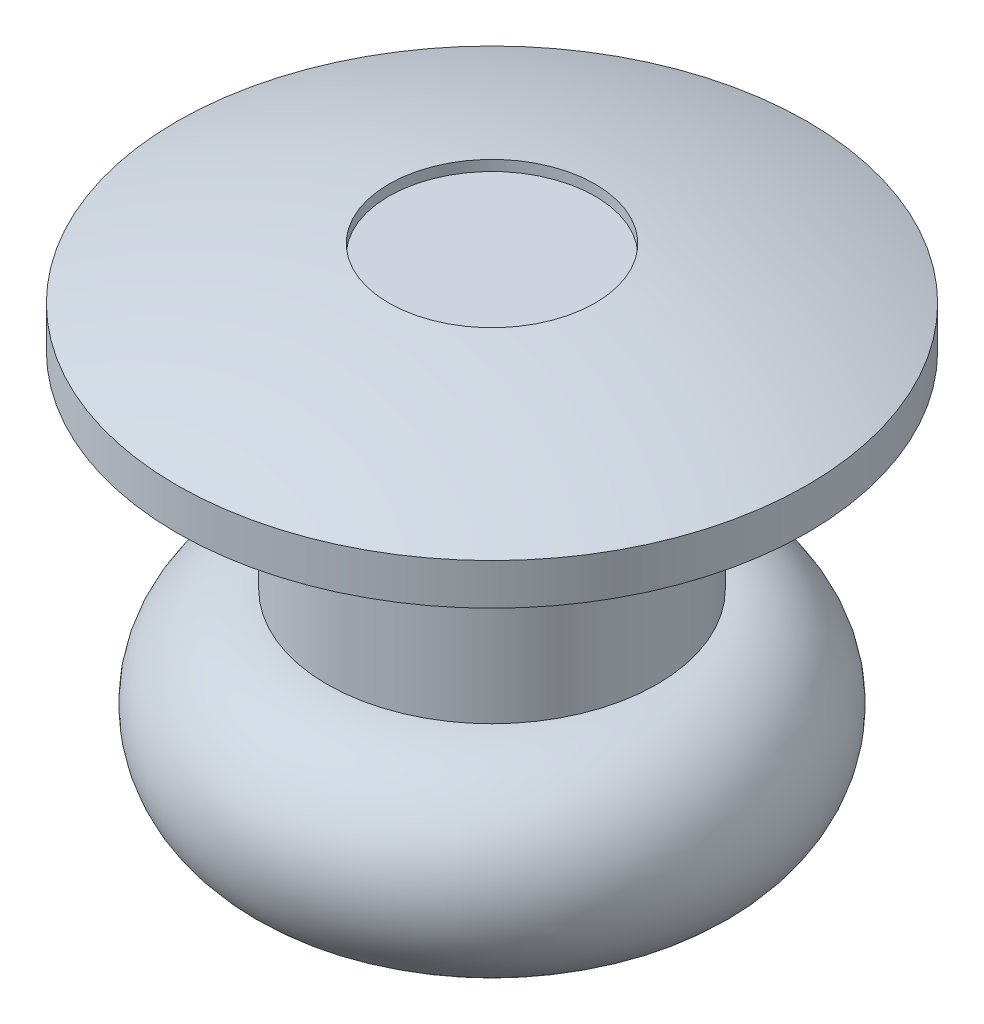
ISO-10303-21;
HEADER;
FILE_DESCRIPTION(('STEP AP214'),'2;1');
FILE_NAME('part.step','',(''),(''),'','','');
FILE_SCHEMA(('AUTOMOTIVE_DESIGN { 1 0 10303 214 1 1 1 1 }'));
ENDSEC;
DATA;
#1=APPLICATION_CONTEXT('core data for automotive mechanical design processes');
#2=APPLICATION_PROTOCOL_DEFINITION('international standard','automotive_design',2000,#1);
#3=PRODUCT_CONTEXT('',#1,'mechanical');
#4=PRODUCT('Part','Part','',(#3));
#5=PRODUCT_RELATED_PRODUCT_CATEGORY('part','',(#4));
#6=PRODUCT_DEFINITION_FORMATION('','',#4);
#7=PRODUCT_DEFINITION_CONTEXT('part definition',#1,'design');
#8=PRODUCT_DEFINITION('design','',#6,#7);
#9=PRODUCT_DEFINITION_SHAPE('','',#8);
#10=(LENGTH_UNIT() NAMED_UNIT(*) SI_UNIT(.MILLI.,.METRE.));
#11=(NAMED_UNIT(*) PLANE_ANGLE_UNIT() SI_UNIT($,.RADIAN.));
#12=(NAMED_UNIT(*) SI_UNIT($,.STERADIAN.) SOLID_ANGLE_UNIT());
#13=UNCERTAINTY_MEASURE_WITH_UNIT(LENGTH_MEASURE(1.E-05),#10,'distance_accuracy_value','');
#14=(GEOMETRIC_REPRESENTATION_CONTEXT(3) GLOBAL_UNCERTAINTY_ASSIGNED_CONTEXT((#13)) GLOBAL_UNIT_ASSIGNED_CONTEXT((#10,
#11,#12)) REPRESENTATION_CONTEXT('',''));
#15=CARTESIAN_POINT('',(0.,0.,0.));
#16=DIRECTION('',(0.,0.,1.));
#17=DIRECTION('',(1.,0.,0.));
#18=AXIS2_PLACEMENT_3D('',#15,#16,#17);
#19=CARTESIAN_POINT('',(0.,-0.2,0.));
#20=DIRECTION('',(0.,1.,0.));
#21=DIRECTION('',(-1.,0.,0.));
#22=AXIS2_PLACEMENT_3D('',#19,#20,#21);
#23=CYLINDRICAL_SURFACE('',#22,3.82);
#24=CARTESIAN_POINT('',(0.,-0.7,0.));
#25=DIRECTION('',(0.,1.,0.));
#26=DIRECTION('',(-1.,0.,0.));
#27=AXIS2_PLACEMENT_3D('',#24,#25,#26);
#28=CIRCLE('',#27,3.82);
#29=CARTESIAN_POINT('',(3.82,-0.699999999999999,0.));
#30=VERTEX_POINT('',#29);
#31=EDGE_CURVE('E58',#30,#30,#28,.T.);
#32=ORIENTED_EDGE('',*,*,#31,.F.);
#33=EDGE_LOOP('',(#32));
#34=FACE_BOUND('',#33,.T.);
#35=CARTESIAN_POINT('',(0.,-1.2,0.));
#36=DIRECTION('',(0.,1.,0.));
#37=DIRECTION('',(-1.,0.,0.));
#38=AXIS2_PLACEMENT_3D('',#35,#36,#37);
#39=CIRCLE('',#38,3.82);
#40=CARTESIAN_POINT('',(-3.82,-1.2,0.));
#41=VERTEX_POINT('',#40);
#42=EDGE_CURVE('E10',#41,#41,#39,.T.);
#43=ORIENTED_EDGE('',*,*,#42,.T.);
#44=EDGE_LOOP('',(#43));
#45=FACE_BOUND('',#44,.T.);
#46=ADVANCED_FACE('F33',(#34,#45),#23,.T.);
#47=CARTESIAN_POINT('',(3.82,-1.2,0.));
#48=DIRECTION('',(0.,1.,0.));
#49=DIRECTION('',(-1.,0.,0.));
#50=AXIS2_PLACEMENT_3D('',#47,#48,#49);
#51=PLANE('',#50);
#52=ORIENTED_EDGE('',*,*,#42,.F.);
#53=EDGE_LOOP('',(#52));
#54=FACE_BOUND('',#53,.T.);
#55=CARTESIAN_POINT('',(0.,-1.2,0.));
#56=DIRECTION('',(0.,1.,0.));
#57=DIRECTION('',(-1.,0.,0.));
#58=AXIS2_PLACEMENT_3D('',#55,#56,#57);
#59=CIRCLE('',#58,2.);
#60=CARTESIAN_POINT('',(-2.,-1.2,0.));
#61=VERTEX_POINT('',#60);
#62=EDGE_CURVE('E39',#61,#61,#59,.T.);
#63=ORIENTED_EDGE('',*,*,#62,.T.);
#64=EDGE_LOOP('',(#63));
#65=FACE_BOUND('',#64,.T.);
#66=ADVANCED_FACE('F65',(#54,#65),#51,.F.);
#67=CARTESIAN_POINT('',(0.,-0.2,0.));
#68=DIRECTION('',(0.,1.,0.));
#69=DIRECTION('',(-1.,0.,0.));
#70=AXIS2_PLACEMENT_3D('',#67,#68,#69);
#71=CYLINDRICAL_SURFACE('',#70,2.);
#72=ORIENTED_EDGE('',*,*,#62,.F.);
#73=EDGE_LOOP('',(#72));
#74=FACE_BOUND('',#73,.T.);
#75=CARTESIAN_POINT('',(0.,-3.7,0.));
#76=DIRECTION('',(0.,1.,0.));
#77=DIRECTION('',(-1.,0.,0.));
#78=AXIS2_PLACEMENT_3D('',#75,#76,#77);
#79=CIRCLE('',#78,2.);
#80=CARTESIAN_POINT('',(-2.,-3.7,0.));
#81=VERTEX_POINT('',#80);
#82=EDGE_CURVE('E43',#81,#81,#79,.T.);
#83=ORIENTED_EDGE('',*,*,#82,.T.);
#84=EDGE_LOOP('',(#83));
#85=FACE_BOUND('',#84,.T.);
#86=ADVANCED_FACE('F69',(#74,#85),#71,.T.);
#87=CARTESIAN_POINT('',(0.,-4.9,0.));
#88=DIRECTION('',(0.,1.,0.));
#89=DIRECTION('',(-1.,0.,0.));
#90=AXIS2_PLACEMENT_3D('',#87,#88,#89);
#91=TOROIDAL_SURFACE('',#90,2.,1.2);
#92=ORIENTED_EDGE('',*,*,#82,.F.);
#93=EDGE_LOOP('',(#92));
#94=FACE_BOUND('',#93,.T.);
#95=CARTESIAN_POINT('',(0.,-6.1,0.));
#96=DIRECTION('',(0.,1.,0.));
#97=DIRECTION('',(-1.,0.,0.));
#98=AXIS2_PLACEMENT_3D('',#95,#96,#97);
#99=CIRCLE('',#98,2.);
#100=CARTESIAN_POINT('',(-2.,-6.1,0.));
#101=VERTEX_POINT('',#100);
#102=EDGE_CURVE('E47',#101,#101,#99,.T.);
#103=ORIENTED_EDGE('',*,*,#102,.T.);
#104=EDGE_LOOP('',(#103));
#105=FACE_BOUND('',#104,.T.);
#106=ADVANCED_FACE('F74',(#94,#105),#91,.T.);
#107=CARTESIAN_POINT('',(2.,-6.1,0.));
#108=DIRECTION('',(0.,1.,0.));
#109=DIRECTION('',(-1.,0.,0.));
#110=AXIS2_PLACEMENT_3D('',#107,#108,#109);
#111=PLANE('',#110);
#112=ORIENTED_EDGE('',*,*,#102,.F.);
#113=EDGE_LOOP('',(#112));
#114=FACE_BOUND('',#113,.T.);
#115=ADVANCED_FACE('F80',(#114),#111,.F.);
#116=CARTESIAN_POINT('',(0.,-0.2,0.));
#117=DIRECTION('',(0.,-1.,0.));
#118=DIRECTION('',(1.,0.,0.));
#119=AXIS2_PLACEMENT_3D('',#116,#117,#118);
#120=PLANE('',#119);
#121=CARTESIAN_POINT('',(0.,-0.2,0.));
#122=DIRECTION('',(0.,1.,0.));
#123=DIRECTION('',(-1.,0.,0.));
#124=AXIS2_PLACEMENT_3D('',#121,#122,#123);
#125=CIRCLE('',#124,1.25);
#126=CARTESIAN_POINT('',(-1.25,-0.2,0.));
#127=VERTEX_POINT('',#126);
#128=EDGE_CURVE('E52',#127,#127,#125,.T.);
#129=ORIENTED_EDGE('',*,*,#128,.T.);
#130=EDGE_LOOP('',(#129));
#131=FACE_BOUND('',#130,.T.);
#132=ADVANCED_FACE('F84',(#131),#120,.F.);
#133=CARTESIAN_POINT('',(0.,-0.2,0.));
#134=DIRECTION('',(0.,1.,0.));
#135=DIRECTION('',(-1.,0.,0.));
#136=AXIS2_PLACEMENT_3D('',#133,#134,#135);
#137=CYLINDRICAL_SURFACE('',#136,1.25);
#138=ORIENTED_EDGE('',*,*,#128,.F.);
#139=EDGE_LOOP('',(#138));
#140=FACE_BOUND('',#139,.T.);
#141=CARTESIAN_POINT('',(0.,-0.0727640311195389,0.));
#142=DIRECTION('',(0.,1.,0.));
#143=DIRECTION('',(-1.,0.,0.));
#144=AXIS2_PLACEMENT_3D('',#141,#142,#143);
#145=CIRCLE('',#144,1.25);
#146=CARTESIAN_POINT('',(1.25000000000001,-0.0727640311195404,0.));
#147=VERTEX_POINT('',#146);
#148=EDGE_CURVE('E55',#147,#147,#145,.T.);
#149=ORIENTED_EDGE('',*,*,#148,.T.);
#150=EDGE_LOOP('',(#149));
#151=FACE_BOUND('',#150,.T.);
#152=ADVANCED_FACE('F88',(#140,#151),#137,.F.);
#153=CARTESIAN_POINT('',(0.,-10.7731428571429,0.));
#154=DIRECTION('',(0.,1.,0.));
#155=DIRECTION('',(1.,0.,0.));
#156=AXIS2_PLACEMENT_3D('',#153,#154,#155);
#157=SPHERICAL_SURFACE('',#156,10.7731428571429);
#158=CARTESIAN_POINT('',(1.25000000000001,-0.0727640311195404,0.));
#159=CARTESIAN_POINT('',(1.27743972690055,-0.0759694909310241,0.));
#160=CARTESIAN_POINT('',(1.30486712327214,-0.0792805035479182,0.));
#161=CARTESIAN_POINT('',(1.35969563293125,-0.0861134285906737,0.));
#162=CARTESIAN_POINT('',(1.38709674621877,-0.0896353410165352,0.));
#163=CARTESIAN_POINT('',(1.44187106768358,-0.0968898598753719,0.));
#164=CARTESIAN_POINT('',(1.46924427586086,-0.100622466308347,0.));
#165=CARTESIAN_POINT('',(1.52396116714738,-0.108298151565427,0.));
#166=CARTESIAN_POINT('',(1.55130485025661,-0.112241230389532,0.));
#167=CARTESIAN_POINT('',(1.60596107308491,-0.12033762725252,0.));
#168=CARTESIAN_POINT('',(1.63327361280398,-0.124490945291403,0.));
#169=CARTESIAN_POINT('',(1.68786593240294,-0.133007574724754,0.));
#170=CARTESIAN_POINT('',(1.71514571228283,-0.137370886119222,0.));
#171=CARTESIAN_POINT('',(1.76967089768527,-0.146307244040716,0.));
#172=CARTESIAN_POINT('',(1.79691630320782,-0.150880290567742,0.));
#173=CARTESIAN_POINT('',(1.85137112741394,-0.160235848101206,0.));
#174=CARTESIAN_POINT('',(1.87858054609751,-0.165018359107642,0.));
#175=CARTESIAN_POINT('',(1.9329617862733,-0.174792562554524,0.));
#176=CARTESIAN_POINT('',(1.96013360776552,-0.179784254994969,0.));
#177=CARTESIAN_POINT('',(2.01443804543153,-0.189976525883112,0.));
#178=CARTESIAN_POINT('',(2.04157066160532,-0.195177104330812,0.));
#179=CARTESIAN_POINT('',(2.09579508282766,-0.205786839444407,0.));
#180=CARTESIAN_POINT('',(2.12288688787621,-0.211195996110302,0.));
#181=CARTESIAN_POINT('',(2.17702808345663,-0.222222567526729,0.));
#182=CARTESIAN_POINT('',(2.2040774739885,-0.227839982277259,0.));
#183=CARTESIAN_POINT('',(2.25813223965435,-0.239282737403948,0.));
#184=CARTESIAN_POINT('',(2.28513761478832,-0.245108077780105,0.));
#185=CARTESIAN_POINT('',(2.33910275138218,-0.256966339393238,0.));
#186=CARTESIAN_POINT('',(2.36606251284205,-0.262999260630213,0.));
#187=CARTESIAN_POINT('',(2.41993482651107,-0.275272326914786,0.));
#188=CARTESIAN_POINT('',(2.44684737872022,-0.281512471962383,0.));
#189=CARTESIAN_POINT('',(2.50062368110516,-0.294199616553744,0.));
#190=CARTESIAN_POINT('',(2.52748743128096,-0.300646616097508,0.));
#191=CARTESIAN_POINT('',(2.58116453970487,-0.313747088124347,0.));
#192=CARTESIAN_POINT('',(2.60797789795299,-0.320400560607422,0.));
#193=CARTESIAN_POINT('',(2.66155263560959,-0.33391358473621,0.));
#194=CARTESIAN_POINT('',(2.68831401501807,-0.340773136381924,0.));
#195=CARTESIAN_POINT('',(2.74178321115975,-0.354697912862799,0.));
#196=CARTESIAN_POINT('',(2.76849102789293,-0.36176313769796,0.));
#197=CARTESIAN_POINT('',(2.82185151801839,-0.37609884241206,0.));
#198=CARTESIAN_POINT('',(2.84850419141066,-0.383369322290998,0.));
#199=CARTESIAN_POINT('',(2.90175281745223,-0.398115106799237,0.));
#200=CARTESIAN_POINT('',(2.92834877010154,-0.405590411428539,0.));
#201=CARTESIAN_POINT('',(2.98148238061209,-0.420745403021813,0.));
#202=CARTESIAN_POINT('',(3.00802003847333,-0.428425089985786,0.));
#203=CARTESIAN_POINT('',(3.06103548881274,-0.443988391736646,0.));
#204=CARTESIAN_POINT('',(3.0875132812909,-0.451872006523533,0.));
#205=CARTESIAN_POINT('',(3.14040743381223,-0.467842697339194,0.));
#206=CARTESIAN_POINT('',(3.16682379385539,-0.475929773367967,0.));
#207=CARTESIAN_POINT('',(3.21959351809046,-0.492306908045102,0.));
#208=CARTESIAN_POINT('',(3.24594688228237,-0.500596966693464,0.));
#209=CARTESIAN_POINT('',(3.29858905512743,-0.517379575973066,0.));
#210=CARTESIAN_POINT('',(3.32487786378058,-0.525872126604307,0.));
#211=CARTESIAN_POINT('',(3.37738936967966,-0.543059217233112,0.));
#212=CARTESIAN_POINT('',(3.40361206692559,-0.551753757230675,0.));
#213=CARTESIAN_POINT('',(3.45598979806047,-0.569344312004811,0.));
#214=CARTESIAN_POINT('',(3.48214483194943,-0.578240326781382,0.));
#215=CARTESIAN_POINT('',(3.53438568840269,-0.59623330466301,0.));
#216=CARTESIAN_POINT('',(3.560471510967,-0.605330267768065,0.));
#217=CARTESIAN_POINT('',(3.6125724009835,-0.623724603736377,0.));
#218=CARTESIAN_POINT('',(3.63858746843569,-0.633021976599633,0.));
#219=CARTESIAN_POINT('',(3.69054530831434,-0.651816582499929,0.));
#220=CARTESIAN_POINT('',(3.7164880807408,-0.661313815536968,0.));
#221=CARTESIAN_POINT('',(3.76829979610384,-0.680507577211487,0.));
#222=CARTESIAN_POINT('',(3.79416873904042,-0.690204105848968,0.));
#223=CARTESIAN_POINT('',(3.82,-0.699999999999999,0.));
#224=B_SPLINE_CURVE_WITH_KNOTS('',3,(#158,#159,#160,#161,#162,#163,#164,#165,#166,#167,#168,
#169,#170,#171,#172,#173,#174,#175,#176,#177,#178,#179,#180,#181,#182,#183,#184,#185,#186,#187,
#188,#189,#190,#191,#192,#193,#194,#195,#196,#197,#198,#199,#200,#201,#202,#203,#204,#205,#206,
#207,#208,#209,#210,#211,#212,#213,#214,#215,#216,#217,#218,#219,#220,#221,#222,#223),
.UNSPECIFIED.,.F.,.F.,(4,2,2,2,2,2,2,2,2,2,2,2,2,2,2,2,2,2,2,2,2,2,2,2,2,2,2,2,2,2,2,2,4),(0.,
0.0828787571035527,0.165757514207108,0.248636271310661,0.331515028414214,0.414393785517769,
0.497272542621321,0.580151299724874,0.663030056828427,0.745908813931982,0.828787571035535,
0.911666328139088,0.994545085242643,1.0774238423462,1.16030259944975,1.2431813565533,
1.32606011365686,1.40893887076041,1.49181762786396,1.57469638496752,1.65757514207107,
1.74045389917463,1.82333265627818,1.90621141338173,1.98909017048529,2.07196892758884,
2.15484768469239,2.23772644179595,2.3206051988995,2.40348395600305,2.4863627131066,
2.56924147021016,2.65212022731371),.UNSPECIFIED.);
#225=EDGE_CURVE('BSEAM62',#147,#30,#224,.T.);
#226=ORIENTED_EDGE('',*,*,#148,.F.);
#227=ORIENTED_EDGE('',*,*,#31,.T.);
#228=ORIENTED_EDGE('',*,*,#225,.T.);
#229=ORIENTED_EDGE('',*,*,#225,.F.);
#230=EDGE_LOOP('',(#226,#228,#227,#229));
#231=FACE_BOUND('',#230,.T.);
#232=ADVANCED_FACE('F62',(#231),#157,.T.);
#233=CLOSED_SHELL('',(#46,#66,#86,#106,#115,#132,#152,#232));
#234=MANIFOLD_SOLID_BREP('B2',#233);
#235=ADVANCED_BREP_SHAPE_REPRESENTATION('',(#18,#234),#14);
#236=SHAPE_DEFINITION_REPRESENTATION(#9,#235);
ENDSEC;
END-ISO-10303-21;
